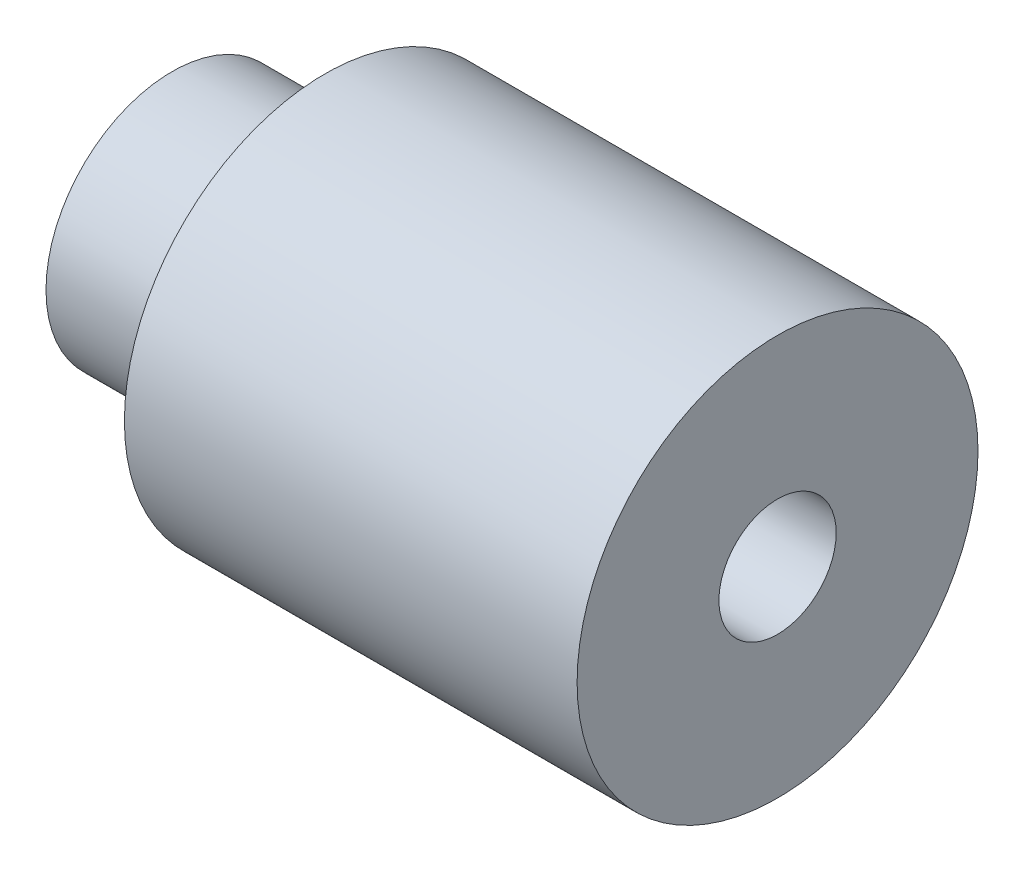
ISO-10303-21;
HEADER;
FILE_DESCRIPTION(('STEP AP214'),'2;1');
FILE_NAME('part.step','',(''),(''),'','','');
FILE_SCHEMA(('AUTOMOTIVE_DESIGN { 1 0 10303 214 1 1 1 1 }'));
ENDSEC;
DATA;
#1=APPLICATION_CONTEXT('core data for automotive mechanical design processes');
#2=APPLICATION_PROTOCOL_DEFINITION('international standard','automotive_design',2000,#1);
#3=PRODUCT_CONTEXT('',#1,'mechanical');
#4=PRODUCT('Part','Part','',(#3));
#5=PRODUCT_RELATED_PRODUCT_CATEGORY('part','',(#4));
#6=PRODUCT_DEFINITION_FORMATION('','',#4);
#7=PRODUCT_DEFINITION_CONTEXT('part definition',#1,'design');
#8=PRODUCT_DEFINITION('design','',#6,#7);
#9=PRODUCT_DEFINITION_SHAPE('','',#8);
#10=(LENGTH_UNIT() NAMED_UNIT(*) SI_UNIT(.MILLI.,.METRE.));
#11=(NAMED_UNIT(*) PLANE_ANGLE_UNIT() SI_UNIT($,.RADIAN.));
#12=(NAMED_UNIT(*) SI_UNIT($,.STERADIAN.) SOLID_ANGLE_UNIT());
#13=UNCERTAINTY_MEASURE_WITH_UNIT(LENGTH_MEASURE(1.E-05),#10,'distance_accuracy_value','');
#14=(GEOMETRIC_REPRESENTATION_CONTEXT(3) GLOBAL_UNCERTAINTY_ASSIGNED_CONTEXT((#13)) GLOBAL_UNIT_ASSIGNED_CONTEXT((#10,
#11,#12)) REPRESENTATION_CONTEXT('',''));
#15=CARTESIAN_POINT('',(0.,0.,0.));
#16=DIRECTION('',(0.,0.,1.));
#17=DIRECTION('',(1.,0.,0.));
#18=AXIS2_PLACEMENT_3D('',#15,#16,#17);
#19=CARTESIAN_POINT('',(0.,0.,0.));
#20=DIRECTION('',(1.,0.,0.));
#21=DIRECTION('',(0.,0.,-1.));
#22=AXIS2_PLACEMENT_3D('',#19,#20,#21);
#23=PLANE('',#22);
#24=CARTESIAN_POINT('',(0.,0.,0.));
#25=DIRECTION('',(1.,0.,0.));
#26=DIRECTION('',(0.,0.,-1.));
#27=AXIS2_PLACEMENT_3D('',#24,#25,#26);
#28=CIRCLE('',#27,4.625);
#29=CARTESIAN_POINT('',(0.,0.,-4.625));
#30=VERTEX_POINT('',#29);
#31=EDGE_CURVE('E41',#30,#30,#28,.T.);
#32=ORIENTED_EDGE('',*,*,#31,.F.);
#33=EDGE_LOOP('',(#32));
#34=FACE_BOUND('',#33,.T.);
#35=CARTESIAN_POINT('',(0.,0.,0.));
#36=DIRECTION('',(1.,0.,0.));
#37=DIRECTION('',(0.,0.,-1.));
#38=AXIS2_PLACEMENT_3D('',#35,#36,#37);
#39=CIRCLE('',#38,2.15);
#40=CARTESIAN_POINT('',(0.,0.,-2.15));
#41=VERTEX_POINT('',#40);
#42=EDGE_CURVE('E48',#41,#41,#39,.T.);
#43=ORIENTED_EDGE('',*,*,#42,.T.);
#44=EDGE_LOOP('',(#43));
#45=FACE_BOUND('',#44,.T.);
#46=ADVANCED_FACE('F37',(#34,#45),#23,.F.);
#47=CARTESIAN_POINT('',(5.6,0.,0.));
#48=DIRECTION('',(-1.,0.,0.));
#49=DIRECTION('',(0.,0.,1.));
#50=AXIS2_PLACEMENT_3D('',#47,#48,#49);
#51=CYLINDRICAL_SURFACE('',#50,4.625);
#52=CARTESIAN_POINT('',(5.6,0.,0.));
#53=DIRECTION('',(1.,0.,0.));
#54=DIRECTION('',(0.,0.,-1.));
#55=AXIS2_PLACEMENT_3D('',#52,#53,#54);
#56=CIRCLE('',#55,4.625);
#57=CARTESIAN_POINT('',(5.6,0.,-4.625));
#58=VERTEX_POINT('',#57);
#59=EDGE_CURVE('E11',#58,#58,#56,.T.);
#60=ORIENTED_EDGE('',*,*,#59,.F.);
#61=EDGE_LOOP('',(#60));
#62=FACE_BOUND('',#61,.T.);
#63=ORIENTED_EDGE('',*,*,#31,.T.);
#64=EDGE_LOOP('',(#63));
#65=FACE_BOUND('',#64,.T.);
#66=ADVANCED_FACE('F39',(#62,#65),#51,.T.);
#67=CARTESIAN_POINT('',(5.6,0.,0.));
#68=DIRECTION('',(-1.,0.,0.));
#69=DIRECTION('',(0.,0.,1.));
#70=AXIS2_PLACEMENT_3D('',#67,#68,#69);
#71=CYLINDRICAL_SURFACE('',#70,2.15);
#72=ORIENTED_EDGE('',*,*,#42,.F.);
#73=EDGE_LOOP('',(#72));
#74=FACE_BOUND('',#73,.T.);
#75=CARTESIAN_POINT('',(22.2,0.,0.));
#76=DIRECTION('',(1.,0.,0.));
#77=DIRECTION('',(0.,0.,-1.));
#78=AXIS2_PLACEMENT_3D('',#75,#76,#77);
#79=CIRCLE('',#78,2.15);
#80=CARTESIAN_POINT('',(22.2,0.,-2.15));
#81=VERTEX_POINT('',#80);
#82=EDGE_CURVE('E56',#81,#81,#79,.F.);
#83=ORIENTED_EDGE('',*,*,#82,.F.);
#84=EDGE_LOOP('',(#83));
#85=FACE_BOUND('',#84,.T.);
#86=ADVANCED_FACE('F65',(#74,#85),#71,.F.);
#87=CARTESIAN_POINT('',(5.6,0.,0.));
#88=DIRECTION('',(1.,0.,0.));
#89=DIRECTION('',(0.,0.,-1.));
#90=AXIS2_PLACEMENT_3D('',#87,#88,#89);
#91=PLANE('',#90);
#92=CARTESIAN_POINT('',(5.6,0.,0.));
#93=DIRECTION('',(1.,0.,0.));
#94=DIRECTION('',(0.,0.,-1.));
#95=AXIS2_PLACEMENT_3D('',#92,#93,#94);
#96=CIRCLE('',#95,7.35);
#97=CARTESIAN_POINT('',(5.6,0.,7.35));
#98=VERTEX_POINT('',#97);
#99=EDGE_CURVE('E53',#98,#98,#96,.T.);
#100=ORIENTED_EDGE('',*,*,#99,.F.);
#101=EDGE_LOOP('',(#100));
#102=FACE_BOUND('',#101,.T.);
#103=ORIENTED_EDGE('',*,*,#59,.T.);
#104=EDGE_LOOP('',(#103));
#105=FACE_BOUND('',#104,.T.);
#106=ADVANCED_FACE('F67',(#102,#105),#91,.F.);
#107=CARTESIAN_POINT('',(22.2,0.,0.));
#108=DIRECTION('',(-1.,0.,0.));
#109=DIRECTION('',(0.,0.,1.));
#110=AXIS2_PLACEMENT_3D('',#107,#108,#109);
#111=CYLINDRICAL_SURFACE('',#110,7.35);
#112=CARTESIAN_POINT('',(22.2,0.,0.));
#113=DIRECTION('',(1.,0.,0.));
#114=DIRECTION('',(0.,0.,-1.));
#115=AXIS2_PLACEMENT_3D('',#112,#113,#114);
#116=CIRCLE('',#115,7.35);
#117=CARTESIAN_POINT('',(22.2,0.,7.35));
#118=VERTEX_POINT('',#117);
#119=EDGE_CURVE('E52',#118,#118,#116,.T.);
#120=CARTESIAN_POINT('',(22.2,0.,7.35));
#121=CARTESIAN_POINT('',(22.0270833333333,0.,7.35));
#122=CARTESIAN_POINT('',(21.8541666666667,0.,7.35));
#123=CARTESIAN_POINT('',(21.5083333333333,0.,7.35));
#124=CARTESIAN_POINT('',(21.3354166666667,0.,7.35));
#125=CARTESIAN_POINT('',(20.9895833333333,0.,7.35));
#126=CARTESIAN_POINT('',(20.8166666666667,0.,7.35));
#127=CARTESIAN_POINT('',(20.4708333333333,0.,7.35));
#128=CARTESIAN_POINT('',(20.2979166666667,0.,7.35));
#129=CARTESIAN_POINT('',(19.9520833333333,0.,7.35));
#130=CARTESIAN_POINT('',(19.7791666666667,0.,7.35));
#131=CARTESIAN_POINT('',(19.4333333333333,0.,7.35));
#132=CARTESIAN_POINT('',(19.2604166666667,0.,7.35));
#133=CARTESIAN_POINT('',(18.9145833333333,0.,7.35));
#134=CARTESIAN_POINT('',(18.7416666666667,0.,7.35));
#135=CARTESIAN_POINT('',(18.3958333333333,0.,7.35));
#136=CARTESIAN_POINT('',(18.2229166666667,0.,7.35));
#137=CARTESIAN_POINT('',(17.8770833333333,0.,7.35));
#138=CARTESIAN_POINT('',(17.7041666666667,0.,7.35));
#139=CARTESIAN_POINT('',(17.3583333333333,0.,7.35));
#140=CARTESIAN_POINT('',(17.1854166666667,0.,7.35));
#141=CARTESIAN_POINT('',(16.8395833333333,0.,7.35));
#142=CARTESIAN_POINT('',(16.6666666666667,0.,7.35));
#143=CARTESIAN_POINT('',(16.3208333333333,0.,7.35));
#144=CARTESIAN_POINT('',(16.1479166666667,0.,7.35));
#145=CARTESIAN_POINT('',(15.8020833333333,0.,7.35));
#146=CARTESIAN_POINT('',(15.6291666666667,0.,7.35));
#147=CARTESIAN_POINT('',(15.2833333333333,0.,7.35));
#148=CARTESIAN_POINT('',(15.1104166666667,0.,7.35));
#149=CARTESIAN_POINT('',(14.7645833333333,0.,7.35));
#150=CARTESIAN_POINT('',(14.5916666666667,0.,7.35));
#151=CARTESIAN_POINT('',(14.2458333333333,0.,7.35));
#152=CARTESIAN_POINT('',(14.0729166666667,0.,7.35));
#153=CARTESIAN_POINT('',(13.7270833333333,0.,7.35));
#154=CARTESIAN_POINT('',(13.5541666666667,0.,7.35));
#155=CARTESIAN_POINT('',(13.2083333333333,0.,7.35));
#156=CARTESIAN_POINT('',(13.0354166666667,0.,7.35));
#157=CARTESIAN_POINT('',(12.6895833333333,0.,7.35));
#158=CARTESIAN_POINT('',(12.5166666666667,0.,7.35));
#159=CARTESIAN_POINT('',(12.1708333333333,0.,7.35));
#160=CARTESIAN_POINT('',(11.9979166666667,0.,7.35));
#161=CARTESIAN_POINT('',(11.6520833333333,0.,7.35));
#162=CARTESIAN_POINT('',(11.4791666666667,0.,7.35));
#163=CARTESIAN_POINT('',(11.1333333333333,0.,7.35));
#164=CARTESIAN_POINT('',(10.9604166666667,0.,7.35));
#165=CARTESIAN_POINT('',(10.6145833333333,0.,7.35));
#166=CARTESIAN_POINT('',(10.4416666666667,0.,7.35));
#167=CARTESIAN_POINT('',(10.0958333333333,0.,7.35));
#168=CARTESIAN_POINT('',(9.92291666666667,0.,7.35));
#169=CARTESIAN_POINT('',(9.57708333333333,0.,7.35));
#170=CARTESIAN_POINT('',(9.40416666666667,0.,7.35));
#171=CARTESIAN_POINT('',(9.05833333333333,0.,7.35));
#172=CARTESIAN_POINT('',(8.88541666666666,0.,7.35));
#173=CARTESIAN_POINT('',(8.53958333333333,0.,7.35));
#174=CARTESIAN_POINT('',(8.36666666666667,0.,7.35));
#175=CARTESIAN_POINT('',(8.02083333333333,0.,7.35));
#176=CARTESIAN_POINT('',(7.84791666666666,0.,7.35));
#177=CARTESIAN_POINT('',(7.50208333333333,0.,7.35));
#178=CARTESIAN_POINT('',(7.32916666666666,0.,7.35));
#179=CARTESIAN_POINT('',(6.98333333333333,0.,7.35));
#180=CARTESIAN_POINT('',(6.81041666666666,0.,7.35));
#181=CARTESIAN_POINT('',(6.46458333333333,0.,7.35));
#182=CARTESIAN_POINT('',(6.29166666666667,0.,7.35));
#183=CARTESIAN_POINT('',(5.94583333333333,0.,7.35));
#184=CARTESIAN_POINT('',(5.77291666666667,0.,7.35));
#185=CARTESIAN_POINT('',(5.6,0.,7.35));
#186=B_SPLINE_CURVE_WITH_KNOTS('',3,(#120,#121,#122,#123,#124,#125,#126,#127,#128,#129,#130,
#131,#132,#133,#134,#135,#136,#137,#138,#139,#140,#141,#142,#143,#144,#145,#146,#147,#148,#149,
#150,#151,#152,#153,#154,#155,#156,#157,#158,#159,#160,#161,#162,#163,#164,#165,#166,#167,#168,
#169,#170,#171,#172,#173,#174,#175,#176,#177,#178,#179,#180,#181,#182,#183,#184,#185),
.UNSPECIFIED.,.F.,.F.,(4,2,2,2,2,2,2,2,2,2,2,2,2,2,2,2,2,2,2,2,2,2,2,2,2,2,2,2,2,2,2,2,4),(0.,
0.518750000000002,1.0375,1.55625,2.075,2.59375,3.1125,3.63125,4.15,4.66875,5.1875,5.70625,6.225,
6.74375,7.2625,7.78125,8.3,8.81875,9.3375,9.85625,10.375,10.89375,11.4125,11.93125,12.45,
12.96875,13.4875,14.00625,14.525,15.04375,15.5625,16.08125,16.6),.UNSPECIFIED.);
#187=EDGE_CURVE('BSEAM74',#118,#98,#186,.T.);
#188=ORIENTED_EDGE('',*,*,#119,.F.);
#189=ORIENTED_EDGE('',*,*,#99,.T.);
#190=ORIENTED_EDGE('',*,*,#187,.T.);
#191=ORIENTED_EDGE('',*,*,#187,.F.);
#192=EDGE_LOOP('',(#188,#190,#189,#191));
#193=FACE_BOUND('',#192,.T.);
#194=ADVANCED_FACE('F74',(#193),#111,.T.);
#195=CARTESIAN_POINT('',(22.2,0.,0.));
#196=DIRECTION('',(1.,0.,0.));
#197=DIRECTION('',(0.,0.,-1.));
#198=AXIS2_PLACEMENT_3D('',#195,#196,#197);
#199=PLANE('',#198);
#200=ORIENTED_EDGE('',*,*,#82,.T.);
#201=EDGE_LOOP('',(#200));
#202=FACE_BOUND('',#201,.T.);
#203=ORIENTED_EDGE('',*,*,#119,.T.);
#204=EDGE_LOOP('',(#203));
#205=FACE_BOUND('',#204,.T.);
#206=ADVANCED_FACE('F62',(#202,#205),#199,.T.);
#207=CLOSED_SHELL('',(#46,#66,#86,#106,#194,#206));
#208=MANIFOLD_SOLID_BREP('B2',#207);
#209=ADVANCED_BREP_SHAPE_REPRESENTATION('',(#18,#208),#14);
#210=SHAPE_DEFINITION_REPRESENTATION(#9,#209);
ENDSEC;
END-ISO-10303-21;
